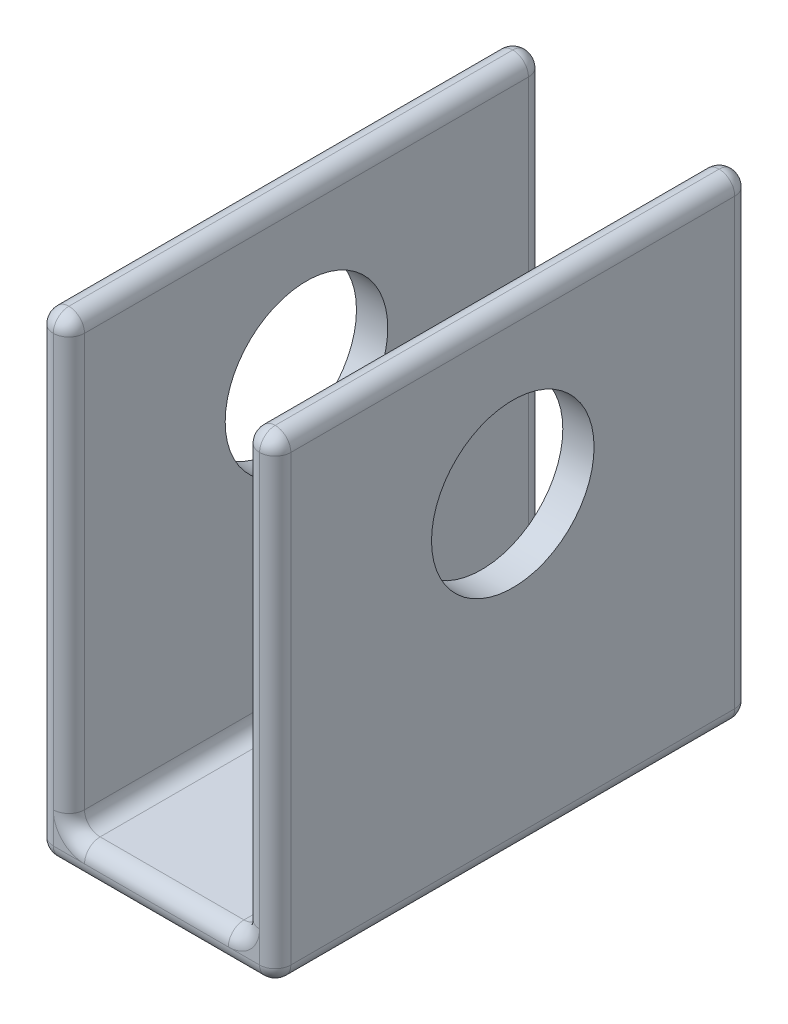
ISO-10303-21;
HEADER;
FILE_DESCRIPTION(('STEP AP214'),'2;1');
FILE_NAME('part.step','',(''),(''),'','','');
FILE_SCHEMA(('AUTOMOTIVE_DESIGN { 1 0 10303 214 1 1 1 1 }'));
ENDSEC;
DATA;
#1=APPLICATION_CONTEXT('core data for automotive mechanical design processes');
#2=APPLICATION_PROTOCOL_DEFINITION('international standard','automotive_design',2000,#1);
#3=PRODUCT_CONTEXT('',#1,'mechanical');
#4=PRODUCT('Part','Part','',(#3));
#5=PRODUCT_RELATED_PRODUCT_CATEGORY('part','',(#4));
#6=PRODUCT_DEFINITION_FORMATION('','',#4);
#7=PRODUCT_DEFINITION_CONTEXT('part definition',#1,'design');
#8=PRODUCT_DEFINITION('design','',#6,#7);
#9=PRODUCT_DEFINITION_SHAPE('','',#8);
#10=(LENGTH_UNIT() NAMED_UNIT(*) SI_UNIT(.MILLI.,.METRE.));
#11=(NAMED_UNIT(*) PLANE_ANGLE_UNIT() SI_UNIT($,.RADIAN.));
#12=(NAMED_UNIT(*) SI_UNIT($,.STERADIAN.) SOLID_ANGLE_UNIT());
#13=UNCERTAINTY_MEASURE_WITH_UNIT(LENGTH_MEASURE(1.E-05),#10,'distance_accuracy_value','');
#14=(GEOMETRIC_REPRESENTATION_CONTEXT(3) GLOBAL_UNCERTAINTY_ASSIGNED_CONTEXT((#13)) GLOBAL_UNIT_ASSIGNED_CONTEXT((#10,
#11,#12)) REPRESENTATION_CONTEXT('',''));
#15=CARTESIAN_POINT('',(0.,0.,0.));
#16=DIRECTION('',(0.,0.,1.));
#17=DIRECTION('',(1.,0.,0.));
#18=AXIS2_PLACEMENT_3D('',#15,#16,#17);
#19=CARTESIAN_POINT('',(-8.25,36.75,38.));
#20=DIRECTION('',(0.,0.,-1.));
#21=DIRECTION('',(-1.,0.,0.));
#22=AXIS2_PLACEMENT_3D('',#19,#20,#21);
#23=PLANE('',#22);
#24=CARTESIAN_POINT('',(5.75,3.75,38.));
#25=DIRECTION('',(0.,0.,-1.));
#26=DIRECTION('',(-1.,0.,0.));
#27=AXIS2_PLACEMENT_3D('',#24,#25,#26);
#28=CIRCLE('',#27,2.5);
#29=CARTESIAN_POINT('',(5.75,1.25,38.));
#30=VERTEX_POINT('',#29);
#31=CARTESIAN_POINT('',(8.25,3.75,38.));
#32=VERTEX_POINT('',#31);
#33=EDGE_CURVE('E210',#30,#32,#28,.F.);
#34=ORIENTED_EDGE('',*,*,#33,.F.);
#35=DIRECTION('',(1.,0.,0.));
#36=VECTOR('',#35,1.);
#37=CARTESIAN_POINT('',(-8.25,1.25,38.));
#38=LINE('',#37,#36);
#39=CARTESIAN_POINT('',(8.25,1.25,38.));
#40=VERTEX_POINT('',#39);
#41=EDGE_CURVE('E11',#30,#40,#38,.T.);
#42=ORIENTED_EDGE('',*,*,#41,.T.);
#43=DIRECTION('',(0.,1.,0.));
#44=VECTOR('',#43,1.);
#45=CARTESIAN_POINT('',(8.25,36.75,38.));
#46=LINE('',#45,#44);
#47=EDGE_CURVE('E56',#40,#32,#46,.T.);
#48=ORIENTED_EDGE('',*,*,#47,.T.);
#49=EDGE_LOOP('',(#34,#42,#48));
#50=FACE_BOUND('',#49,.T.);
#51=ADVANCED_FACE('F45',(#50),#23,.F.);
#52=CARTESIAN_POINT('',(-8.25,36.75,0.));
#53=DIRECTION('',(0.,0.,-1.));
#54=DIRECTION('',(-1.,0.,0.));
#55=AXIS2_PLACEMENT_3D('',#52,#53,#54);
#56=PLANE('',#55);
#57=CARTESIAN_POINT('',(-5.75,3.75,0.));
#58=DIRECTION('',(0.,0.,-1.));
#59=DIRECTION('',(-1.,0.,0.));
#60=AXIS2_PLACEMENT_3D('',#57,#58,#59);
#61=CIRCLE('',#60,2.5);
#62=CARTESIAN_POINT('',(-5.75,1.25,0.));
#63=VERTEX_POINT('',#62);
#64=CARTESIAN_POINT('',(-8.25,3.75,0.));
#65=VERTEX_POINT('',#64);
#66=EDGE_CURVE('E520',#63,#65,#61,.T.);
#67=ORIENTED_EDGE('',*,*,#66,.F.);
#68=DIRECTION('',(1.,0.,0.));
#69=VECTOR('',#68,1.);
#70=CARTESIAN_POINT('',(-9.5,1.25,0.));
#71=LINE('',#70,#69);
#72=CARTESIAN_POINT('',(-8.25,1.25,0.));
#73=VERTEX_POINT('',#72);
#74=EDGE_CURVE('E514',#63,#73,#71,.F.);
#75=ORIENTED_EDGE('',*,*,#74,.T.);
#76=DIRECTION('',(0.,-1.,0.));
#77=VECTOR('',#76,1.);
#78=CARTESIAN_POINT('',(-8.25,38.,0.));
#79=LINE('',#78,#77);
#80=EDGE_CURVE('E517',#73,#65,#79,.F.);
#81=ORIENTED_EDGE('',*,*,#80,.T.);
#82=EDGE_LOOP('',(#67,#75,#81));
#83=FACE_BOUND('',#82,.T.);
#84=ADVANCED_FACE('F255',(#83),#56,.T.);
#85=CARTESIAN_POINT('',(8.25,36.75,38.));
#86=DIRECTION('',(0.,0.,-1.));
#87=DIRECTION('',(-1.,0.,0.));
#88=AXIS2_PLACEMENT_3D('',#85,#86,#87);
#89=CYLINDRICAL_SURFACE('',#88,1.25);
#90=DIRECTION('',(0.,0.,-1.));
#91=VECTOR('',#90,1.);
#92=CARTESIAN_POINT('',(8.25000000000001,38.,38.));
#93=LINE('',#92,#91);
#94=CARTESIAN_POINT('',(8.25000000000001,38.,36.75));
#95=VERTEX_POINT('',#94);
#96=CARTESIAN_POINT('',(8.25000000000001,38.,1.25));
#97=VERTEX_POINT('',#96);
#98=EDGE_CURVE('E431',#95,#97,#93,.T.);
#99=ORIENTED_EDGE('',*,*,#98,.T.);
#100=CARTESIAN_POINT('',(8.25,36.75,1.25));
#101=DIRECTION('',(0.,0.,-1.));
#102=DIRECTION('',(-1.,0.,0.));
#103=AXIS2_PLACEMENT_3D('',#100,#101,#102);
#104=CIRCLE('',#103,1.25);
#105=CARTESIAN_POINT('',(7.,36.75,1.25));
#106=VERTEX_POINT('',#105);
#107=EDGE_CURVE('E443',#97,#106,#104,.F.);
#108=ORIENTED_EDGE('',*,*,#107,.T.);
#109=DIRECTION('',(0.,0.,-1.));
#110=VECTOR('',#109,1.);
#111=CARTESIAN_POINT('',(7.,36.75,38.));
#112=LINE('',#111,#110);
#113=CARTESIAN_POINT('',(7.,36.75,36.75));
#114=VERTEX_POINT('',#113);
#115=EDGE_CURVE('E427',#114,#106,#112,.T.);
#116=ORIENTED_EDGE('',*,*,#115,.F.);
#117=CARTESIAN_POINT('',(8.25,36.75,36.75));
#118=DIRECTION('',(0.,0.,-1.));
#119=DIRECTION('',(-1.,0.,0.));
#120=AXIS2_PLACEMENT_3D('',#117,#118,#119);
#121=CIRCLE('',#120,1.25);
#122=EDGE_CURVE('E440',#114,#95,#121,.T.);
#123=ORIENTED_EDGE('',*,*,#122,.T.);
#124=EDGE_LOOP('',(#99,#108,#116,#123));
#125=FACE_BOUND('',#124,.T.);
#126=ADVANCED_FACE('F262',(#125),#89,.T.);
#127=CARTESIAN_POINT('',(7.,2.5,38.));
#128=DIRECTION('',(1.,0.,0.));
#129=DIRECTION('',(0.,1.,0.));
#130=AXIS2_PLACEMENT_3D('',#127,#128,#129);
#131=PLANE('',#130);
#132=CARTESIAN_POINT('',(7.,25.,19.));
#133=DIRECTION('',(1.,0.,0.));
#134=DIRECTION('',(0.,1.,0.));
#135=AXIS2_PLACEMENT_3D('',#132,#133,#134);
#136=CIRCLE('',#135,6.5);
#137=CARTESIAN_POINT('',(7.,31.5,19.));
#138=VERTEX_POINT('',#137);
#139=EDGE_CURVE('E417',#138,#138,#136,.T.);
#140=ORIENTED_EDGE('',*,*,#139,.T.);
#141=EDGE_LOOP('',(#140));
#142=FACE_BOUND('',#141,.T.);
#143=ORIENTED_EDGE('',*,*,#115,.T.);
#144=DIRECTION('',(0.,-1.,0.));
#145=VECTOR('',#144,1.);
#146=CARTESIAN_POINT('',(7.,2.5,1.25));
#147=LINE('',#146,#145);
#148=CARTESIAN_POINT('',(7.,3.75,1.25));
#149=VERTEX_POINT('',#148);
#150=EDGE_CURVE('E491',#106,#149,#147,.T.);
#151=ORIENTED_EDGE('',*,*,#150,.T.);
#152=DIRECTION('',(0.,0.,-1.));
#153=VECTOR('',#152,1.);
#154=CARTESIAN_POINT('',(7.,3.75,38.));
#155=LINE('',#154,#153);
#156=CARTESIAN_POINT('',(7.,3.75,36.75));
#157=VERTEX_POINT('',#156);
#158=EDGE_CURVE('E488',#149,#157,#155,.F.);
#159=ORIENTED_EDGE('',*,*,#158,.T.);
#160=DIRECTION('',(0.,-1.,0.));
#161=VECTOR('',#160,1.);
#162=CARTESIAN_POINT('',(7.,2.5,36.75));
#163=LINE('',#162,#161);
#164=EDGE_CURVE('E485',#157,#114,#163,.F.);
#165=ORIENTED_EDGE('',*,*,#164,.T.);
#166=EDGE_LOOP('',(#143,#151,#159,#165));
#167=FACE_BOUND('',#166,.T.);
#168=ADVANCED_FACE('F721',(#142,#167),#131,.F.);
#169=CARTESIAN_POINT('',(-7.,2.5,38.));
#170=DIRECTION('',(0.,-1.,0.));
#171=DIRECTION('',(0.,0.,-1.));
#172=AXIS2_PLACEMENT_3D('',#169,#170,#171);
#173=PLANE('',#172);
#174=DIRECTION('',(0.,0.,-1.));
#175=VECTOR('',#174,1.);
#176=CARTESIAN_POINT('',(5.75,2.5,0.));
#177=LINE('',#176,#175);
#178=CARTESIAN_POINT('',(5.75,2.5,36.75));
#179=VERTEX_POINT('',#178);
#180=CARTESIAN_POINT('',(5.75,2.5,1.25));
#181=VERTEX_POINT('',#180);
#182=EDGE_CURVE('E478',#179,#181,#177,.T.);
#183=ORIENTED_EDGE('',*,*,#182,.T.);
#184=DIRECTION('',(-1.,0.,0.));
#185=VECTOR('',#184,1.);
#186=CARTESIAN_POINT('',(-7.,2.5,1.25));
#187=LINE('',#186,#185);
#188=CARTESIAN_POINT('',(-5.75,2.5,1.25));
#189=VERTEX_POINT('',#188);
#190=EDGE_CURVE('E482',#181,#189,#187,.T.);
#191=ORIENTED_EDGE('',*,*,#190,.T.);
#192=DIRECTION('',(0.,0.,-1.));
#193=VECTOR('',#192,1.);
#194=CARTESIAN_POINT('',(-5.75,2.5,38.));
#195=LINE('',#194,#193);
#196=CARTESIAN_POINT('',(-5.75,2.5,36.75));
#197=VERTEX_POINT('',#196);
#198=EDGE_CURVE('E475',#189,#197,#195,.F.);
#199=ORIENTED_EDGE('',*,*,#198,.T.);
#200=DIRECTION('',(-1.,0.,0.));
#201=VECTOR('',#200,1.);
#202=CARTESIAN_POINT('',(-7.,2.5,36.75));
#203=LINE('',#202,#201);
#204=EDGE_CURVE('E472',#197,#179,#203,.F.);
#205=ORIENTED_EDGE('',*,*,#204,.T.);
#206=EDGE_LOOP('',(#183,#191,#199,#205));
#207=FACE_BOUND('',#206,.T.);
#208=ADVANCED_FACE('F723',(#207),#173,.F.);
#209=CARTESIAN_POINT('',(-7.,2.5,38.));
#210=DIRECTION('',(-1.,0.,0.));
#211=DIRECTION('',(0.,0.,1.));
#212=AXIS2_PLACEMENT_3D('',#209,#210,#211);
#213=PLANE('',#212);
#214=CARTESIAN_POINT('',(-7.,25.,19.));
#215=DIRECTION('',(-1.,0.,0.));
#216=DIRECTION('',(0.,0.,1.));
#217=AXIS2_PLACEMENT_3D('',#214,#215,#216);
#218=CIRCLE('',#217,6.5);
#219=CARTESIAN_POINT('',(-7.,25.,25.5));
#220=VERTEX_POINT('',#219);
#221=EDGE_CURVE('E411',#220,#220,#218,.T.);
#222=ORIENTED_EDGE('',*,*,#221,.T.);
#223=EDGE_LOOP('',(#222));
#224=FACE_BOUND('',#223,.T.);
#225=DIRECTION('',(0.,0.,-1.));
#226=VECTOR('',#225,1.);
#227=CARTESIAN_POINT('',(-7.,3.75,0.));
#228=LINE('',#227,#226);
#229=CARTESIAN_POINT('',(-7.,3.75,36.75));
#230=VERTEX_POINT('',#229);
#231=CARTESIAN_POINT('',(-7.,3.75,1.25));
#232=VERTEX_POINT('',#231);
#233=EDGE_CURVE('E497',#230,#232,#228,.T.);
#234=ORIENTED_EDGE('',*,*,#233,.T.);
#235=DIRECTION('',(0.,1.,0.));
#236=VECTOR('',#235,1.);
#237=CARTESIAN_POINT('',(-7.,36.75,1.25));
#238=LINE('',#237,#236);
#239=CARTESIAN_POINT('',(-7.,36.75,1.25));
#240=VERTEX_POINT('',#239);
#241=EDGE_CURVE('E500',#232,#240,#238,.T.);
#242=ORIENTED_EDGE('',*,*,#241,.T.);
#243=DIRECTION('',(0.,0.,-1.));
#244=VECTOR('',#243,1.);
#245=CARTESIAN_POINT('',(-7.,36.75,38.));
#246=LINE('',#245,#244);
#247=CARTESIAN_POINT('',(-7.,36.75,36.75));
#248=VERTEX_POINT('',#247);
#249=EDGE_CURVE('E423',#248,#240,#246,.T.);
#250=ORIENTED_EDGE('',*,*,#249,.F.);
#251=DIRECTION('',(0.,1.,0.));
#252=VECTOR('',#251,1.);
#253=CARTESIAN_POINT('',(-7.,2.5,36.75));
#254=LINE('',#253,#252);
#255=EDGE_CURVE('E494',#248,#230,#254,.F.);
#256=ORIENTED_EDGE('',*,*,#255,.T.);
#257=EDGE_LOOP('',(#234,#242,#250,#256));
#258=FACE_BOUND('',#257,.T.);
#259=ADVANCED_FACE('F635',(#224,#258),#213,.F.);
#260=CARTESIAN_POINT('',(-8.25,36.75,38.));
#261=DIRECTION('',(0.,0.,-1.));
#262=DIRECTION('',(-1.,0.,0.));
#263=AXIS2_PLACEMENT_3D('',#260,#261,#262);
#264=CYLINDRICAL_SURFACE('',#263,1.25);
#265=ORIENTED_EDGE('',*,*,#249,.T.);
#266=CARTESIAN_POINT('',(-8.25,36.75,1.25));
#267=DIRECTION('',(0.,0.,-1.));
#268=DIRECTION('',(-1.,0.,0.));
#269=AXIS2_PLACEMENT_3D('',#266,#267,#268);
#270=CIRCLE('',#269,1.25);
#271=CARTESIAN_POINT('',(-8.25000000000001,38.,1.25));
#272=VERTEX_POINT('',#271);
#273=EDGE_CURVE('E437',#240,#272,#270,.F.);
#274=ORIENTED_EDGE('',*,*,#273,.T.);
#275=DIRECTION('',(0.,0.,-1.));
#276=VECTOR('',#275,1.);
#277=CARTESIAN_POINT('',(-8.25000000000001,38.,38.));
#278=LINE('',#277,#276);
#279=CARTESIAN_POINT('',(-8.25000000000001,38.,36.75));
#280=VERTEX_POINT('',#279);
#281=EDGE_CURVE('E99',#280,#272,#278,.T.);
#282=ORIENTED_EDGE('',*,*,#281,.F.);
#283=CARTESIAN_POINT('',(-8.25,36.75,36.75));
#284=DIRECTION('',(0.,0.,-1.));
#285=DIRECTION('',(-1.,0.,0.));
#286=AXIS2_PLACEMENT_3D('',#283,#284,#285);
#287=CIRCLE('',#286,1.25);
#288=EDGE_CURVE('E434',#280,#248,#287,.T.);
#289=ORIENTED_EDGE('',*,*,#288,.T.);
#290=EDGE_LOOP('',(#265,#274,#282,#289));
#291=FACE_BOUND('',#290,.T.);
#292=ADVANCED_FACE('F639',(#291),#264,.T.);
#293=CARTESIAN_POINT('',(-9.5,0.,38.));
#294=DIRECTION('',(1.,0.,0.));
#295=DIRECTION('',(0.,0.,-1.));
#296=AXIS2_PLACEMENT_3D('',#293,#294,#295);
#297=PLANE('',#296);
#298=DIRECTION('',(0.,-1.,0.));
#299=VECTOR('',#298,1.);
#300=CARTESIAN_POINT('',(-9.5,0.,1.25));
#301=LINE('',#300,#299);
#302=CARTESIAN_POINT('',(-9.5,36.75,1.25));
#303=VERTEX_POINT('',#302);
#304=CARTESIAN_POINT('',(-9.5,1.25,1.25));
#305=VERTEX_POINT('',#304);
#306=EDGE_CURVE('E465',#303,#305,#301,.T.);
#307=ORIENTED_EDGE('',*,*,#306,.T.);
#308=DIRECTION('',(0.,0.,-1.));
#309=VECTOR('',#308,1.);
#310=CARTESIAN_POINT('',(-9.5,1.25,38.));
#311=LINE('',#310,#309);
#312=CARTESIAN_POINT('',(-9.5,1.25,36.75));
#313=VERTEX_POINT('',#312);
#314=EDGE_CURVE('E468',#305,#313,#311,.F.);
#315=ORIENTED_EDGE('',*,*,#314,.T.);
#316=DIRECTION('',(0.,-1.,0.));
#317=VECTOR('',#316,1.);
#318=CARTESIAN_POINT('',(-9.5,0.,36.75));
#319=LINE('',#318,#317);
#320=CARTESIAN_POINT('',(-9.5,36.75,36.75));
#321=VERTEX_POINT('',#320);
#322=EDGE_CURVE('E307',#313,#321,#319,.F.);
#323=ORIENTED_EDGE('',*,*,#322,.T.);
#324=DIRECTION('',(0.,0.,-1.));
#325=VECTOR('',#324,1.);
#326=CARTESIAN_POINT('',(-9.5,36.75,38.));
#327=LINE('',#326,#325);
#328=EDGE_CURVE('E460',#321,#303,#327,.T.);
#329=ORIENTED_EDGE('',*,*,#328,.T.);
#330=EDGE_LOOP('',(#307,#315,#323,#329));
#331=FACE_BOUND('',#330,.T.);
#332=CARTESIAN_POINT('',(-9.5,25.,19.));
#333=DIRECTION('',(1.,0.,0.));
#334=DIRECTION('',(0.,0.,-1.));
#335=AXIS2_PLACEMENT_3D('',#332,#333,#334);
#336=CIRCLE('',#335,6.5);
#337=CARTESIAN_POINT('',(-9.5,25.,12.5));
#338=VERTEX_POINT('',#337);
#339=EDGE_CURVE('E405',#338,#338,#336,.T.);
#340=ORIENTED_EDGE('',*,*,#339,.T.);
#341=EDGE_LOOP('',(#340));
#342=FACE_BOUND('',#341,.T.);
#343=ADVANCED_FACE('F651',(#331,#342),#297,.F.);
#344=CARTESIAN_POINT('',(-9.5,0.,38.));
#345=DIRECTION('',(0.,1.,0.));
#346=DIRECTION('',(0.,0.,1.));
#347=AXIS2_PLACEMENT_3D('',#344,#345,#346);
#348=PLANE('',#347);
#349=DIRECTION('',(1.,0.,0.));
#350=VECTOR('',#349,1.);
#351=CARTESIAN_POINT('',(-9.5,0.,36.75));
#352=LINE('',#351,#350);
#353=CARTESIAN_POINT('',(8.25,0.,36.75));
#354=VERTEX_POINT('',#353);
#355=CARTESIAN_POINT('',(-8.25,0.,36.75));
#356=VERTEX_POINT('',#355);
#357=EDGE_CURVE('E447',#354,#356,#352,.F.);
#358=ORIENTED_EDGE('',*,*,#357,.T.);
#359=DIRECTION('',(0.,0.,-1.));
#360=VECTOR('',#359,1.);
#361=CARTESIAN_POINT('',(-8.25,0.,38.));
#362=LINE('',#361,#360);
#363=CARTESIAN_POINT('',(-8.25,0.,1.25));
#364=VERTEX_POINT('',#363);
#365=EDGE_CURVE('E456',#356,#364,#362,.T.);
#366=ORIENTED_EDGE('',*,*,#365,.T.);
#367=DIRECTION('',(1.,0.,0.));
#368=VECTOR('',#367,1.);
#369=CARTESIAN_POINT('',(9.5,0.,1.25));
#370=LINE('',#369,#368);
#371=CARTESIAN_POINT('',(8.25,0.,1.25));
#372=VERTEX_POINT('',#371);
#373=EDGE_CURVE('E453',#364,#372,#370,.T.);
#374=ORIENTED_EDGE('',*,*,#373,.T.);
#375=DIRECTION('',(0.,0.,-1.));
#376=VECTOR('',#375,1.);
#377=CARTESIAN_POINT('',(8.25,0.,38.));
#378=LINE('',#377,#376);
#379=EDGE_CURVE('E450',#372,#354,#378,.F.);
#380=ORIENTED_EDGE('',*,*,#379,.T.);
#381=EDGE_LOOP('',(#358,#366,#374,#380));
#382=FACE_BOUND('',#381,.T.);
#383=ADVANCED_FACE('F276',(#382),#348,.F.);
#384=CARTESIAN_POINT('',(9.5,0.,38.));
#385=DIRECTION('',(-1.,0.,0.));
#386=DIRECTION('',(0.,0.,1.));
#387=AXIS2_PLACEMENT_3D('',#384,#385,#386);
#388=PLANE('',#387);
#389=DIRECTION('',(0.,0.,-1.));
#390=VECTOR('',#389,1.);
#391=CARTESIAN_POINT('',(9.5,1.25,38.));
#392=LINE('',#391,#390);
#393=CARTESIAN_POINT('',(9.5,1.25,36.75));
#394=VERTEX_POINT('',#393);
#395=CARTESIAN_POINT('',(9.5,1.25,1.25));
#396=VERTEX_POINT('',#395);
#397=EDGE_CURVE('E530',#394,#396,#392,.T.);
#398=ORIENTED_EDGE('',*,*,#397,.T.);
#399=DIRECTION('',(0.,1.,0.));
#400=VECTOR('',#399,1.);
#401=CARTESIAN_POINT('',(9.5,38.,1.25));
#402=LINE('',#401,#400);
#403=CARTESIAN_POINT('',(9.5,36.75,1.25));
#404=VERTEX_POINT('',#403);
#405=EDGE_CURVE('E533',#396,#404,#402,.T.);
#406=ORIENTED_EDGE('',*,*,#405,.T.);
#407=DIRECTION('',(0.,0.,-1.));
#408=VECTOR('',#407,1.);
#409=CARTESIAN_POINT('',(9.5,36.75,38.));
#410=LINE('',#409,#408);
#411=CARTESIAN_POINT('',(9.5,36.75,36.75));
#412=VERTEX_POINT('',#411);
#413=EDGE_CURVE('E527',#404,#412,#410,.F.);
#414=ORIENTED_EDGE('',*,*,#413,.T.);
#415=DIRECTION('',(0.,1.,0.));
#416=VECTOR('',#415,1.);
#417=CARTESIAN_POINT('',(9.5,0.,36.75));
#418=LINE('',#417,#416);
#419=EDGE_CURVE('E524',#412,#394,#418,.F.);
#420=ORIENTED_EDGE('',*,*,#419,.T.);
#421=EDGE_LOOP('',(#398,#406,#414,#420));
#422=FACE_BOUND('',#421,.T.);
#423=CARTESIAN_POINT('',(9.5,25.,19.));
#424=DIRECTION('',(1.,0.,0.));
#425=DIRECTION('',(0.,0.,-1.));
#426=AXIS2_PLACEMENT_3D('',#423,#424,#425);
#427=CIRCLE('',#426,6.5);
#428=CARTESIAN_POINT('',(9.5,25.,12.5));
#429=VERTEX_POINT('',#428);
#430=EDGE_CURVE('E400',#429,#429,#427,.T.);
#431=ORIENTED_EDGE('',*,*,#430,.F.);
#432=EDGE_LOOP('',(#431));
#433=FACE_BOUND('',#432,.T.);
#434=ADVANCED_FACE('F268',(#422,#433),#388,.F.);
#435=DIRECTION('',(0.,-1.,0.));
#436=VECTOR('',#435,1.);
#437=CARTESIAN_POINT('',(-8.25,36.75,38.));
#438=LINE('',#437,#436);
#439=CARTESIAN_POINT('',(-8.25,3.75,38.));
#440=VERTEX_POINT('',#439);
#441=CARTESIAN_POINT('',(-8.25,1.25,38.));
#442=VERTEX_POINT('',#441);
#443=EDGE_CURVE('E280',#440,#442,#438,.T.);
#444=ORIENTED_EDGE('',*,*,#443,.T.);
#445=DIRECTION('',(1.,0.,0.));
#446=VECTOR('',#445,1.);
#447=CARTESIAN_POINT('',(-8.25,1.25,38.));
#448=LINE('',#447,#446);
#449=CARTESIAN_POINT('',(-5.75,1.25,38.));
#450=VERTEX_POINT('',#449);
#451=EDGE_CURVE('E217',#442,#450,#448,.T.);
#452=ORIENTED_EDGE('',*,*,#451,.T.);
#453=CARTESIAN_POINT('',(-5.75,3.75,38.));
#454=DIRECTION('',(0.,0.,-1.));
#455=DIRECTION('',(-1.,0.,0.));
#456=AXIS2_PLACEMENT_3D('',#453,#454,#455);
#457=CIRCLE('',#456,2.5);
#458=EDGE_CURVE('E281',#440,#450,#457,.F.);
#459=ORIENTED_EDGE('',*,*,#458,.F.);
#460=EDGE_LOOP('',(#444,#452,#459));
#461=FACE_BOUND('',#460,.T.);
#462=ADVANCED_FACE('F257',(#461),#23,.F.);
#463=DIRECTION('',(0.,1.,0.));
#464=VECTOR('',#463,1.);
#465=CARTESIAN_POINT('',(8.25,0.,0.));
#466=LINE('',#465,#464);
#467=CARTESIAN_POINT('',(8.25,3.75,0.));
#468=VERTEX_POINT('',#467);
#469=CARTESIAN_POINT('',(8.25,1.25,0.));
#470=VERTEX_POINT('',#469);
#471=EDGE_CURVE('E503',#468,#470,#466,.F.);
#472=ORIENTED_EDGE('',*,*,#471,.T.);
#473=DIRECTION('',(1.,0.,0.));
#474=VECTOR('',#473,1.);
#475=CARTESIAN_POINT('',(-9.5,1.25,0.));
#476=LINE('',#475,#474);
#477=CARTESIAN_POINT('',(5.75,1.25,0.));
#478=VERTEX_POINT('',#477);
#479=EDGE_CURVE('E510',#470,#478,#476,.F.);
#480=ORIENTED_EDGE('',*,*,#479,.T.);
#481=CARTESIAN_POINT('',(5.75,3.75,0.));
#482=DIRECTION('',(0.,0.,-1.));
#483=DIRECTION('',(-1.,0.,0.));
#484=AXIS2_PLACEMENT_3D('',#481,#482,#483);
#485=CIRCLE('',#484,2.5);
#486=EDGE_CURVE('E506',#468,#478,#485,.T.);
#487=ORIENTED_EDGE('',*,*,#486,.F.);
#488=EDGE_LOOP('',(#472,#480,#487));
#489=FACE_BOUND('',#488,.T.);
#490=ADVANCED_FACE('F265',(#489),#56,.T.);
#491=CARTESIAN_POINT('',(-9.5,25.,19.));
#492=DIRECTION('',(1.,0.,0.));
#493=DIRECTION('',(0.,0.,-1.));
#494=AXIS2_PLACEMENT_3D('',#491,#492,#493);
#495=CYLINDRICAL_SURFACE('',#494,6.5);
#496=ORIENTED_EDGE('',*,*,#430,.T.);
#497=EDGE_LOOP('',(#496));
#498=FACE_BOUND('',#497,.T.);
#499=ORIENTED_EDGE('',*,*,#139,.F.);
#500=EDGE_LOOP('',(#499));
#501=FACE_BOUND('',#500,.T.);
#502=ADVANCED_FACE('F274',(#498,#501),#495,.F.);
#503=ORIENTED_EDGE('',*,*,#339,.F.);
#504=EDGE_LOOP('',(#503));
#505=FACE_BOUND('',#504,.T.);
#506=ORIENTED_EDGE('',*,*,#221,.F.);
#507=EDGE_LOOP('',(#506));
#508=FACE_BOUND('',#507,.T.);
#509=ADVANCED_FACE('F713',(#505,#508),#495,.F.);
#510=CARTESIAN_POINT('',(8.25,36.75,36.75));
#511=DIRECTION('',(0.,0.,-1.));
#512=DIRECTION('',(-1.,0.,0.));
#513=AXIS2_PLACEMENT_3D('',#510,#511,#512);
#514=SPHERICAL_SURFACE('',#513,1.25);
#515=CARTESIAN_POINT('',(8.25000000000001,36.75,36.75));
#516=DIRECTION('',(-1.,0.,0.));
#517=DIRECTION('',(0.,0.,1.));
#518=AXIS2_PLACEMENT_3D('',#515,#516,#517);
#519=CIRCLE('',#518,1.25);
#520=CARTESIAN_POINT('',(8.25,36.75,38.));
#521=VERTEX_POINT('',#520);
#522=EDGE_CURVE('E49',#521,#95,#519,.T.);
#523=ORIENTED_EDGE('',*,*,#522,.T.);
#524=ORIENTED_EDGE('',*,*,#122,.F.);
#525=CARTESIAN_POINT('',(8.25,36.75,36.75));
#526=DIRECTION('',(0.,-1.,0.));
#527=DIRECTION('',(1.,0.,0.));
#528=AXIS2_PLACEMENT_3D('',#525,#526,#527);
#529=CIRCLE('',#528,1.25);
#530=EDGE_CURVE('E393',#521,#114,#529,.T.);
#531=ORIENTED_EDGE('',*,*,#530,.F.);
#532=EDGE_LOOP('',(#523,#524,#531));
#533=FACE_BOUND('',#532,.T.);
#534=ADVANCED_FACE('F47',(#533),#514,.T.);
#535=CARTESIAN_POINT('',(8.25,36.75,36.75));
#536=DIRECTION('',(0.,0.,1.));
#537=DIRECTION('',(1.,0.,0.));
#538=AXIS2_PLACEMENT_3D('',#535,#536,#537);
#539=SPHERICAL_SURFACE('',#538,1.25);
#540=CARTESIAN_POINT('',(8.25,36.75,36.75));
#541=DIRECTION('',(0.,0.,1.));
#542=DIRECTION('',(1.,0.,0.));
#543=AXIS2_PLACEMENT_3D('',#540,#541,#542);
#544=CIRCLE('',#543,1.25);
#545=EDGE_CURVE('E383',#95,#412,#544,.F.);
#546=ORIENTED_EDGE('',*,*,#545,.F.);
#547=ORIENTED_EDGE('',*,*,#522,.F.);
#548=CARTESIAN_POINT('',(8.25,36.75,36.75));
#549=DIRECTION('',(0.,1.,0.));
#550=DIRECTION('',(0.,0.,1.));
#551=AXIS2_PLACEMENT_3D('',#548,#549,#550);
#552=CIRCLE('',#551,1.25);
#553=EDGE_CURVE('E387',#412,#521,#552,.F.);
#554=ORIENTED_EDGE('',*,*,#553,.F.);
#555=EDGE_LOOP('',(#546,#547,#554));
#556=FACE_BOUND('',#555,.T.);
#557=ADVANCED_FACE('F708',(#556),#539,.T.);
#558=CARTESIAN_POINT('',(8.25,36.75,36.75));
#559=DIRECTION('',(0.,-1.,0.));
#560=DIRECTION('',(1.,0.,0.));
#561=AXIS2_PLACEMENT_3D('',#558,#559,#560);
#562=CYLINDRICAL_SURFACE('',#561,1.25);
#563=CARTESIAN_POINT('',(8.25,3.75,36.75));
#564=DIRECTION('',(0.,-1.,0.));
#565=DIRECTION('',(0.,0.,-1.));
#566=AXIS2_PLACEMENT_3D('',#563,#564,#565);
#567=CIRCLE('',#566,1.25);
#568=EDGE_CURVE('E380',#32,#157,#567,.T.);
#569=ORIENTED_EDGE('',*,*,#568,.F.);
#570=DIRECTION('',(0.,-1.,0.));
#571=VECTOR('',#570,1.);
#572=CARTESIAN_POINT('',(8.25,36.75,38.));
#573=LINE('',#572,#571);
#574=EDGE_CURVE('E391',#521,#32,#573,.T.);
#575=ORIENTED_EDGE('',*,*,#574,.F.);
#576=ORIENTED_EDGE('',*,*,#530,.T.);
#577=ORIENTED_EDGE('',*,*,#164,.F.);
#578=EDGE_LOOP('',(#569,#575,#576,#577));
#579=FACE_BOUND('',#578,.T.);
#580=ADVANCED_FACE('F706',(#579),#562,.T.);
#581=CARTESIAN_POINT('',(8.25,36.75,36.75));
#582=DIRECTION('',(0.,1.,0.));
#583=DIRECTION('',(0.,0.,1.));
#584=AXIS2_PLACEMENT_3D('',#581,#582,#583);
#585=CYLINDRICAL_SURFACE('',#584,1.25);
#586=ORIENTED_EDGE('',*,*,#574,.T.);
#587=ORIENTED_EDGE('',*,*,#47,.F.);
#588=CARTESIAN_POINT('',(8.25,1.25,36.75));
#589=DIRECTION('',(0.,-1.,0.));
#590=DIRECTION('',(0.,0.,-1.));
#591=AXIS2_PLACEMENT_3D('',#588,#589,#590);
#592=CIRCLE('',#591,1.25);
#593=EDGE_CURVE('E377',#394,#40,#592,.T.);
#594=ORIENTED_EDGE('',*,*,#593,.F.);
#595=ORIENTED_EDGE('',*,*,#419,.F.);
#596=ORIENTED_EDGE('',*,*,#553,.T.);
#597=EDGE_LOOP('',(#586,#587,#594,#595,#596));
#598=FACE_BOUND('',#597,.T.);
#599=ADVANCED_FACE('F681',(#598),#585,.T.);
#600=CARTESIAN_POINT('',(8.25,36.75,38.));
#601=DIRECTION('',(0.,0.,-1.));
#602=DIRECTION('',(-1.,0.,0.));
#603=AXIS2_PLACEMENT_3D('',#600,#601,#602);
#604=CYLINDRICAL_SURFACE('',#603,1.25);
#605=CARTESIAN_POINT('',(8.25,36.75,1.25));
#606=DIRECTION('',(0.,0.,-1.));
#607=DIRECTION('',(-1.,0.,0.));
#608=AXIS2_PLACEMENT_3D('',#605,#606,#607);
#609=CIRCLE('',#608,1.25);
#610=EDGE_CURVE('E373',#97,#404,#609,.T.);
#611=ORIENTED_EDGE('',*,*,#610,.F.);
#612=ORIENTED_EDGE('',*,*,#98,.F.);
#613=ORIENTED_EDGE('',*,*,#545,.T.);
#614=ORIENTED_EDGE('',*,*,#413,.F.);
#615=EDGE_LOOP('',(#611,#612,#613,#614));
#616=FACE_BOUND('',#615,.T.);
#617=ADVANCED_FACE('F700',(#616),#604,.T.);
#618=CARTESIAN_POINT('',(8.25,36.75,1.25));
#619=DIRECTION('',(0.,0.,-1.));
#620=DIRECTION('',(-1.,0.,0.));
#621=AXIS2_PLACEMENT_3D('',#618,#619,#620);
#622=SPHERICAL_SURFACE('',#621,1.25);
#623=ORIENTED_EDGE('',*,*,#107,.F.);
#624=CARTESIAN_POINT('',(8.25,36.75,1.25));
#625=DIRECTION('',(1.,0.,0.));
#626=DIRECTION('',(0.,0.,-1.));
#627=AXIS2_PLACEMENT_3D('',#624,#625,#626);
#628=CIRCLE('',#627,1.25);
#629=CARTESIAN_POINT('',(8.25,36.75,0.));
#630=VERTEX_POINT('',#629);
#631=EDGE_CURVE('E83',#630,#97,#628,.T.);
#632=ORIENTED_EDGE('',*,*,#631,.F.);
#633=CARTESIAN_POINT('',(8.25,36.75,1.25));
#634=DIRECTION('',(0.,-1.,0.));
#635=DIRECTION('',(1.,0.,0.));
#636=AXIS2_PLACEMENT_3D('',#633,#634,#635);
#637=CIRCLE('',#636,1.25);
#638=EDGE_CURVE('E368',#106,#630,#637,.T.);
#639=ORIENTED_EDGE('',*,*,#638,.F.);
#640=EDGE_LOOP('',(#623,#632,#639));
#641=FACE_BOUND('',#640,.T.);
#642=ADVANCED_FACE('F694',(#641),#622,.T.);
#643=CARTESIAN_POINT('',(5.75,3.75,36.75));
#644=DIRECTION('',(0.,0.,-1.));
#645=DIRECTION('',(-1.,0.,0.));
#646=AXIS2_PLACEMENT_3D('',#643,#644,#645);
#647=TOROIDAL_SURFACE('',#646,2.5,1.25);
#648=ORIENTED_EDGE('',*,*,#33,.T.);
#649=ORIENTED_EDGE('',*,*,#568,.T.);
#650=CARTESIAN_POINT('',(5.75,3.75,36.75));
#651=DIRECTION('',(0.,0.,-1.));
#652=DIRECTION('',(-1.,0.,0.));
#653=AXIS2_PLACEMENT_3D('',#650,#651,#652);
#654=CIRCLE('',#653,1.25);
#655=EDGE_CURVE('E225',#179,#157,#654,.F.);
#656=ORIENTED_EDGE('',*,*,#655,.F.);
#657=CARTESIAN_POINT('',(5.75,1.25,36.75));
#658=DIRECTION('',(1.,0.,0.));
#659=DIRECTION('',(0.,0.,-1.));
#660=AXIS2_PLACEMENT_3D('',#657,#658,#659);
#661=CIRCLE('',#660,1.25);
#662=EDGE_CURVE('E221',#30,#179,#661,.F.);
#663=ORIENTED_EDGE('',*,*,#662,.F.);
#664=EDGE_LOOP('',(#648,#649,#656,#663));
#665=FACE_BOUND('',#664,.T.);
#666=ADVANCED_FACE('F223',(#665),#647,.T.);
#667=CARTESIAN_POINT('',(8.25,1.25,36.75));
#668=DIRECTION('',(0.,0.,1.));
#669=DIRECTION('',(1.,0.,0.));
#670=AXIS2_PLACEMENT_3D('',#667,#668,#669);
#671=SPHERICAL_SURFACE('',#670,1.25);
#672=CARTESIAN_POINT('',(8.25,1.25,36.75));
#673=DIRECTION('',(0.,0.,1.));
#674=DIRECTION('',(1.,0.,0.));
#675=AXIS2_PLACEMENT_3D('',#672,#673,#674);
#676=CIRCLE('',#675,1.25);
#677=EDGE_CURVE('E360',#394,#354,#676,.F.);
#678=ORIENTED_EDGE('',*,*,#677,.F.);
#679=ORIENTED_EDGE('',*,*,#593,.T.);
#680=CARTESIAN_POINT('',(8.25,1.25,36.75));
#681=DIRECTION('',(1.,0.,0.));
#682=DIRECTION('',(0.,1.,0.));
#683=AXIS2_PLACEMENT_3D('',#680,#681,#682);
#684=CIRCLE('',#683,1.25);
#685=EDGE_CURVE('E65',#354,#40,#684,.F.);
#686=ORIENTED_EDGE('',*,*,#685,.F.);
#687=EDGE_LOOP('',(#678,#679,#686));
#688=FACE_BOUND('',#687,.T.);
#689=ADVANCED_FACE('F683',(#688),#671,.T.);
#690=CARTESIAN_POINT('',(8.25,36.75,1.25));
#691=DIRECTION('',(0.,1.,0.));
#692=DIRECTION('',(0.,0.,1.));
#693=AXIS2_PLACEMENT_3D('',#690,#691,#692);
#694=SPHERICAL_SURFACE('',#693,1.25);
#695=ORIENTED_EDGE('',*,*,#631,.T.);
#696=ORIENTED_EDGE('',*,*,#610,.T.);
#697=CARTESIAN_POINT('',(8.25,36.75,1.25));
#698=DIRECTION('',(0.,1.,0.));
#699=DIRECTION('',(0.,0.,1.));
#700=AXIS2_PLACEMENT_3D('',#697,#698,#699);
#701=CIRCLE('',#700,1.25);
#702=EDGE_CURVE('E357',#630,#404,#701,.F.);
#703=ORIENTED_EDGE('',*,*,#702,.F.);
#704=EDGE_LOOP('',(#695,#696,#703));
#705=FACE_BOUND('',#704,.T.);
#706=ADVANCED_FACE('F685',(#705),#694,.T.);
#707=CARTESIAN_POINT('',(8.25,2.5,1.25));
#708=DIRECTION('',(0.,1.,0.));
#709=DIRECTION('',(-1.,0.,0.));
#710=AXIS2_PLACEMENT_3D('',#707,#708,#709);
#711=CYLINDRICAL_SURFACE('',#710,1.25);
#712=ORIENTED_EDGE('',*,*,#150,.F.);
#713=ORIENTED_EDGE('',*,*,#638,.T.);
#714=DIRECTION('',(0.,-1.,0.));
#715=VECTOR('',#714,1.);
#716=CARTESIAN_POINT('',(8.25,36.75,0.));
#717=LINE('',#716,#715);
#718=EDGE_CURVE('E353',#468,#630,#717,.F.);
#719=ORIENTED_EDGE('',*,*,#718,.F.);
#720=CARTESIAN_POINT('',(8.25,3.75,1.25));
#721=DIRECTION('',(0.,-1.,0.));
#722=DIRECTION('',(0.,0.,-1.));
#723=AXIS2_PLACEMENT_3D('',#720,#721,#722);
#724=CIRCLE('',#723,1.25);
#725=EDGE_CURVE('E349',#149,#468,#724,.T.);
#726=ORIENTED_EDGE('',*,*,#725,.F.);
#727=EDGE_LOOP('',(#712,#713,#719,#726));
#728=FACE_BOUND('',#727,.T.);
#729=ADVANCED_FACE('F691',(#728),#711,.T.);
#730=CARTESIAN_POINT('',(5.75,3.75,38.));
#731=DIRECTION('',(0.,0.,1.));
#732=DIRECTION('',(1.,0.,0.));
#733=AXIS2_PLACEMENT_3D('',#730,#731,#732);
#734=CYLINDRICAL_SURFACE('',#733,1.25);
#735=ORIENTED_EDGE('',*,*,#655,.T.);
#736=ORIENTED_EDGE('',*,*,#158,.F.);
#737=CARTESIAN_POINT('',(5.75,3.75,1.25));
#738=DIRECTION('',(0.,0.,-1.));
#739=DIRECTION('',(-1.,0.,0.));
#740=AXIS2_PLACEMENT_3D('',#737,#738,#739);
#741=CIRCLE('',#740,1.25);
#742=EDGE_CURVE('E345',#181,#149,#741,.F.);
#743=ORIENTED_EDGE('',*,*,#742,.F.);
#744=ORIENTED_EDGE('',*,*,#182,.F.);
#745=EDGE_LOOP('',(#735,#736,#743,#744));
#746=FACE_BOUND('',#745,.T.);
#747=ADVANCED_FACE('F252',(#746),#734,.F.);
#748=CARTESIAN_POINT('',(-8.25,1.25,36.75));
#749=DIRECTION('',(-1.,0.,0.));
#750=DIRECTION('',(0.,0.,1.));
#751=AXIS2_PLACEMENT_3D('',#748,#749,#750);
#752=CYLINDRICAL_SURFACE('',#751,1.25);
#753=CARTESIAN_POINT('',(-5.75,1.25,36.75));
#754=DIRECTION('',(-1.,0.,0.));
#755=DIRECTION('',(0.,0.,1.));
#756=AXIS2_PLACEMENT_3D('',#753,#754,#755);
#757=CIRCLE('',#756,1.25);
#758=EDGE_CURVE('E236',#450,#197,#757,.T.);
#759=ORIENTED_EDGE('',*,*,#758,.F.);
#760=DIRECTION('',(-1.,0.,0.));
#761=VECTOR('',#760,1.);
#762=CARTESIAN_POINT('',(-8.25,1.25,38.));
#763=LINE('',#762,#761);
#764=EDGE_CURVE('E230',#30,#450,#763,.T.);
#765=ORIENTED_EDGE('',*,*,#764,.F.);
#766=ORIENTED_EDGE('',*,*,#662,.T.);
#767=ORIENTED_EDGE('',*,*,#204,.F.);
#768=EDGE_LOOP('',(#759,#765,#766,#767));
#769=FACE_BOUND('',#768,.T.);
#770=ADVANCED_FACE('F234',(#769),#752,.T.);
#771=CARTESIAN_POINT('',(-8.25,1.25,36.75));
#772=DIRECTION('',(1.,0.,0.));
#773=DIRECTION('',(0.,0.,-1.));
#774=AXIS2_PLACEMENT_3D('',#771,#772,#773);
#775=CYLINDRICAL_SURFACE('',#774,1.25);
#776=ORIENTED_EDGE('',*,*,#764,.T.);
#777=ORIENTED_EDGE('',*,*,#451,.F.);
#778=CARTESIAN_POINT('',(-8.25,1.25,36.75));
#779=DIRECTION('',(-1.,0.,0.));
#780=DIRECTION('',(0.,0.,1.));
#781=AXIS2_PLACEMENT_3D('',#778,#779,#780);
#782=CIRCLE('',#781,1.25);
#783=EDGE_CURVE('E290',#356,#442,#782,.T.);
#784=ORIENTED_EDGE('',*,*,#783,.F.);
#785=ORIENTED_EDGE('',*,*,#357,.F.);
#786=ORIENTED_EDGE('',*,*,#685,.T.);
#787=ORIENTED_EDGE('',*,*,#41,.F.);
#788=EDGE_LOOP('',(#776,#777,#784,#785,#786,#787));
#789=FACE_BOUND('',#788,.T.);
#790=ADVANCED_FACE('F241',(#789),#775,.T.);
#791=CARTESIAN_POINT('',(8.25,1.25,38.));
#792=DIRECTION('',(0.,0.,-1.));
#793=DIRECTION('',(-1.,0.,0.));
#794=AXIS2_PLACEMENT_3D('',#791,#792,#793);
#795=CYLINDRICAL_SURFACE('',#794,1.25);
#796=ORIENTED_EDGE('',*,*,#677,.T.);
#797=ORIENTED_EDGE('',*,*,#379,.F.);
#798=CARTESIAN_POINT('',(8.25,1.25,1.25));
#799=DIRECTION('',(0.,0.,-1.));
#800=DIRECTION('',(-1.,0.,0.));
#801=AXIS2_PLACEMENT_3D('',#798,#799,#800);
#802=CIRCLE('',#801,1.25);
#803=EDGE_CURVE('E303',#396,#372,#802,.T.);
#804=ORIENTED_EDGE('',*,*,#803,.F.);
#805=ORIENTED_EDGE('',*,*,#397,.F.);
#806=EDGE_LOOP('',(#796,#797,#804,#805));
#807=FACE_BOUND('',#806,.T.);
#808=ADVANCED_FACE('F243',(#807),#795,.T.);
#809=CARTESIAN_POINT('',(8.25,0.,1.25));
#810=DIRECTION('',(0.,-1.,0.));
#811=DIRECTION('',(0.,0.,-1.));
#812=AXIS2_PLACEMENT_3D('',#809,#810,#811);
#813=CYLINDRICAL_SURFACE('',#812,1.25);
#814=ORIENTED_EDGE('',*,*,#702,.T.);
#815=ORIENTED_EDGE('',*,*,#405,.F.);
#816=CARTESIAN_POINT('',(8.25,1.25,1.25));
#817=DIRECTION('',(0.,-1.,0.));
#818=DIRECTION('',(0.,0.,-1.));
#819=AXIS2_PLACEMENT_3D('',#816,#817,#818);
#820=CIRCLE('',#819,1.25);
#821=EDGE_CURVE('E330',#470,#396,#820,.T.);
#822=ORIENTED_EDGE('',*,*,#821,.F.);
#823=ORIENTED_EDGE('',*,*,#471,.F.);
#824=ORIENTED_EDGE('',*,*,#718,.T.);
#825=EDGE_LOOP('',(#814,#815,#822,#823,#824));
#826=FACE_BOUND('',#825,.T.);
#827=ADVANCED_FACE('F249',(#826),#813,.T.);
#828=CARTESIAN_POINT('',(5.75,3.75,1.25));
#829=DIRECTION('',(0.,0.,-1.));
#830=DIRECTION('',(-1.,0.,0.));
#831=AXIS2_PLACEMENT_3D('',#828,#829,#830);
#832=TOROIDAL_SURFACE('',#831,2.5,1.25);
#833=ORIENTED_EDGE('',*,*,#725,.T.);
#834=ORIENTED_EDGE('',*,*,#486,.T.);
#835=CARTESIAN_POINT('',(5.75,1.25,1.25));
#836=DIRECTION('',(1.,0.,0.));
#837=DIRECTION('',(0.,0.,-1.));
#838=AXIS2_PLACEMENT_3D('',#835,#836,#837);
#839=CIRCLE('',#838,1.25);
#840=EDGE_CURVE('E326',#181,#478,#839,.F.);
#841=ORIENTED_EDGE('',*,*,#840,.F.);
#842=ORIENTED_EDGE('',*,*,#742,.T.);
#843=EDGE_LOOP('',(#833,#834,#841,#842));
#844=FACE_BOUND('',#843,.T.);
#845=ADVANCED_FACE('F669',(#844),#832,.T.);
#846=CARTESIAN_POINT('',(-5.75,3.75,36.75));
#847=DIRECTION('',(0.,0.,-1.));
#848=DIRECTION('',(-1.,0.,0.));
#849=AXIS2_PLACEMENT_3D('',#846,#847,#848);
#850=TOROIDAL_SURFACE('',#849,2.5,1.25);
#851=CARTESIAN_POINT('',(-5.75,3.75,36.75));
#852=DIRECTION('',(0.,0.,-1.));
#853=DIRECTION('',(-1.,0.,0.));
#854=AXIS2_PLACEMENT_3D('',#851,#852,#853);
#855=CIRCLE('',#854,1.25);
#856=EDGE_CURVE('E322',#230,#197,#855,.F.);
#857=ORIENTED_EDGE('',*,*,#856,.F.);
#858=CARTESIAN_POINT('',(-8.25,3.75,36.75));
#859=DIRECTION('',(0.,-1.,0.));
#860=DIRECTION('',(0.,0.,-1.));
#861=AXIS2_PLACEMENT_3D('',#858,#859,#860);
#862=CIRCLE('',#861,1.25);
#863=EDGE_CURVE('E302',#440,#230,#862,.F.);
#864=ORIENTED_EDGE('',*,*,#863,.F.);
#865=ORIENTED_EDGE('',*,*,#458,.T.);
#866=ORIENTED_EDGE('',*,*,#758,.T.);
#867=EDGE_LOOP('',(#857,#864,#865,#866));
#868=FACE_BOUND('',#867,.T.);
#869=ADVANCED_FACE('F658',(#868),#850,.T.);
#870=CARTESIAN_POINT('',(-8.25,36.75,36.75));
#871=DIRECTION('',(0.,0.,-1.));
#872=DIRECTION('',(-1.,0.,0.));
#873=AXIS2_PLACEMENT_3D('',#870,#871,#872);
#874=SPHERICAL_SURFACE('',#873,1.25);
#875=CARTESIAN_POINT('',(-8.25,36.75,36.75));
#876=DIRECTION('',(0.,-1.,0.));
#877=DIRECTION('',(1.,0.,0.));
#878=AXIS2_PLACEMENT_3D('',#875,#876,#877);
#879=CIRCLE('',#878,1.25);
#880=CARTESIAN_POINT('',(-8.25,36.75,38.));
#881=VERTEX_POINT('',#880);
#882=EDGE_CURVE('E340',#248,#881,#879,.T.);
#883=ORIENTED_EDGE('',*,*,#882,.F.);
#884=ORIENTED_EDGE('',*,*,#288,.F.);
#885=CARTESIAN_POINT('',(-8.25,36.75,36.75));
#886=DIRECTION('',(-1.,0.,0.));
#887=DIRECTION('',(0.,-1.,0.));
#888=AXIS2_PLACEMENT_3D('',#885,#886,#887);
#889=CIRCLE('',#888,1.25);
#890=EDGE_CURVE('E313',#881,#280,#889,.T.);
#891=ORIENTED_EDGE('',*,*,#890,.F.);
#892=EDGE_LOOP('',(#883,#884,#891));
#893=FACE_BOUND('',#892,.T.);
#894=ADVANCED_FACE('F642',(#893),#874,.T.);
#895=CARTESIAN_POINT('',(-8.25,36.75,36.75));
#896=DIRECTION('',(0.,1.,0.));
#897=DIRECTION('',(0.,0.,1.));
#898=AXIS2_PLACEMENT_3D('',#895,#896,#897);
#899=CYLINDRICAL_SURFACE('',#898,1.25);
#900=ORIENTED_EDGE('',*,*,#255,.F.);
#901=ORIENTED_EDGE('',*,*,#882,.T.);
#902=DIRECTION('',(0.,1.,0.));
#903=VECTOR('',#902,1.);
#904=CARTESIAN_POINT('',(-8.25,36.75,38.));
#905=LINE('',#904,#903);
#906=EDGE_CURVE('E309',#440,#881,#905,.T.);
#907=ORIENTED_EDGE('',*,*,#906,.F.);
#908=ORIENTED_EDGE('',*,*,#863,.T.);
#909=EDGE_LOOP('',(#900,#901,#907,#908));
#910=FACE_BOUND('',#909,.T.);
#911=ADVANCED_FACE('F655',(#910),#899,.T.);
#912=CARTESIAN_POINT('',(-8.25,1.25,36.75));
#913=DIRECTION('',(0.,0.,1.));
#914=DIRECTION('',(0.,-1.,0.));
#915=AXIS2_PLACEMENT_3D('',#912,#913,#914);
#916=SPHERICAL_SURFACE('',#915,1.25);
#917=CARTESIAN_POINT('',(-8.25,1.25,36.75));
#918=DIRECTION('',(0.,0.,1.));
#919=DIRECTION('',(1.,0.,0.));
#920=AXIS2_PLACEMENT_3D('',#917,#918,#919);
#921=CIRCLE('',#920,1.25);
#922=EDGE_CURVE('E299',#356,#313,#921,.F.);
#923=ORIENTED_EDGE('',*,*,#922,.F.);
#924=ORIENTED_EDGE('',*,*,#783,.T.);
#925=CARTESIAN_POINT('',(-8.25,1.25,36.75));
#926=DIRECTION('',(0.,-1.,0.));
#927=DIRECTION('',(1.,0.,0.));
#928=AXIS2_PLACEMENT_3D('',#925,#926,#927);
#929=CIRCLE('',#928,1.25);
#930=EDGE_CURVE('E297',#313,#442,#929,.F.);
#931=ORIENTED_EDGE('',*,*,#930,.F.);
#932=EDGE_LOOP('',(#923,#924,#931));
#933=FACE_BOUND('',#932,.T.);
#934=ADVANCED_FACE('F296',(#933),#916,.T.);
#935=CARTESIAN_POINT('',(8.25,1.25,1.25));
#936=DIRECTION('',(1.,0.,0.));
#937=DIRECTION('',(0.,0.,-1.));
#938=AXIS2_PLACEMENT_3D('',#935,#936,#937);
#939=SPHERICAL_SURFACE('',#938,1.25);
#940=ORIENTED_EDGE('',*,*,#821,.T.);
#941=ORIENTED_EDGE('',*,*,#803,.T.);
#942=CARTESIAN_POINT('',(8.25,1.25,1.25));
#943=DIRECTION('',(1.,0.,0.));
#944=DIRECTION('',(0.,0.,-1.));
#945=AXIS2_PLACEMENT_3D('',#942,#943,#944);
#946=CIRCLE('',#945,1.25);
#947=EDGE_CURVE('E315',#470,#372,#946,.F.);
#948=ORIENTED_EDGE('',*,*,#947,.F.);
#949=EDGE_LOOP('',(#940,#941,#948));
#950=FACE_BOUND('',#949,.T.);
#951=ADVANCED_FACE('F603',(#950),#939,.T.);
#952=CARTESIAN_POINT('',(-7.,1.25,1.25));
#953=DIRECTION('',(1.,0.,0.));
#954=DIRECTION('',(0.,0.,-1.));
#955=AXIS2_PLACEMENT_3D('',#952,#953,#954);
#956=CYLINDRICAL_SURFACE('',#955,1.25);
#957=ORIENTED_EDGE('',*,*,#190,.F.);
#958=ORIENTED_EDGE('',*,*,#840,.T.);
#959=DIRECTION('',(-1.,0.,0.));
#960=VECTOR('',#959,1.);
#961=CARTESIAN_POINT('',(7.,1.25,0.));
#962=LINE('',#961,#960);
#963=EDGE_CURVE('E592',#63,#478,#962,.F.);
#964=ORIENTED_EDGE('',*,*,#963,.F.);
#965=CARTESIAN_POINT('',(-5.75,1.25,1.25));
#966=DIRECTION('',(-1.,0.,0.));
#967=DIRECTION('',(0.,0.,1.));
#968=AXIS2_PLACEMENT_3D('',#965,#966,#967);
#969=CIRCLE('',#968,1.25);
#970=EDGE_CURVE('E588',#189,#63,#969,.T.);
#971=ORIENTED_EDGE('',*,*,#970,.F.);
#972=EDGE_LOOP('',(#957,#958,#964,#971));
#973=FACE_BOUND('',#972,.T.);
#974=ADVANCED_FACE('F665',(#973),#956,.T.);
#975=CARTESIAN_POINT('',(-5.75,3.75,38.));
#976=DIRECTION('',(0.,0.,1.));
#977=DIRECTION('',(1.,0.,0.));
#978=AXIS2_PLACEMENT_3D('',#975,#976,#977);
#979=CYLINDRICAL_SURFACE('',#978,1.25);
#980=ORIENTED_EDGE('',*,*,#856,.T.);
#981=ORIENTED_EDGE('',*,*,#198,.F.);
#982=CARTESIAN_POINT('',(-5.75,3.75,1.25));
#983=DIRECTION('',(0.,0.,-1.));
#984=DIRECTION('',(-1.,0.,0.));
#985=AXIS2_PLACEMENT_3D('',#982,#983,#984);
#986=CIRCLE('',#985,1.25);
#987=EDGE_CURVE('E584',#232,#189,#986,.F.);
#988=ORIENTED_EDGE('',*,*,#987,.F.);
#989=ORIENTED_EDGE('',*,*,#233,.F.);
#990=EDGE_LOOP('',(#980,#981,#988,#989));
#991=FACE_BOUND('',#990,.T.);
#992=ADVANCED_FACE('F661',(#991),#979,.F.);
#993=CARTESIAN_POINT('',(-8.25,36.75,36.75));
#994=DIRECTION('',(0.,-1.,0.));
#995=DIRECTION('',(0.,0.,-1.));
#996=AXIS2_PLACEMENT_3D('',#993,#994,#995);
#997=CYLINDRICAL_SURFACE('',#996,1.25);
#998=ORIENTED_EDGE('',*,*,#443,.F.);
#999=ORIENTED_EDGE('',*,*,#906,.T.);
#1000=CARTESIAN_POINT('',(-8.25,36.75,36.75));
#1001=DIRECTION('',(0.,1.,0.));
#1002=DIRECTION('',(0.,0.,1.));
#1003=AXIS2_PLACEMENT_3D('',#1000,#1001,#1002);
#1004=CIRCLE('',#1003,1.25);
#1005=EDGE_CURVE('E580',#321,#881,#1004,.T.);
#1006=ORIENTED_EDGE('',*,*,#1005,.F.);
#1007=ORIENTED_EDGE('',*,*,#322,.F.);
#1008=ORIENTED_EDGE('',*,*,#930,.T.);
#1009=EDGE_LOOP('',(#998,#999,#1006,#1007,#1008));
#1010=FACE_BOUND('',#1009,.T.);
#1011=ADVANCED_FACE('F305',(#1010),#997,.T.);
#1012=CARTESIAN_POINT('',(-8.25,1.25,38.));
#1013=DIRECTION('',(0.,0.,-1.));
#1014=DIRECTION('',(-1.,0.,0.));
#1015=AXIS2_PLACEMENT_3D('',#1012,#1013,#1014);
#1016=CYLINDRICAL_SURFACE('',#1015,1.25);
#1017=ORIENTED_EDGE('',*,*,#922,.T.);
#1018=ORIENTED_EDGE('',*,*,#314,.F.);
#1019=CARTESIAN_POINT('',(-8.25,1.25,1.25));
#1020=DIRECTION('',(0.,0.,-1.));
#1021=DIRECTION('',(-1.,0.,0.));
#1022=AXIS2_PLACEMENT_3D('',#1019,#1020,#1021);
#1023=CIRCLE('',#1022,1.25);
#1024=EDGE_CURVE('E576',#364,#305,#1023,.T.);
#1025=ORIENTED_EDGE('',*,*,#1024,.F.);
#1026=ORIENTED_EDGE('',*,*,#365,.F.);
#1027=EDGE_LOOP('',(#1017,#1018,#1025,#1026));
#1028=FACE_BOUND('',#1027,.T.);
#1029=ADVANCED_FACE('F612',(#1028),#1016,.T.);
#1030=CARTESIAN_POINT('',(-9.5,1.25,1.25));
#1031=DIRECTION('',(-1.,0.,0.));
#1032=DIRECTION('',(0.,0.,1.));
#1033=AXIS2_PLACEMENT_3D('',#1030,#1031,#1032);
#1034=CYLINDRICAL_SURFACE('',#1033,1.25);
#1035=ORIENTED_EDGE('',*,*,#947,.T.);
#1036=ORIENTED_EDGE('',*,*,#373,.F.);
#1037=CARTESIAN_POINT('',(-8.25,1.25,1.25));
#1038=DIRECTION('',(-1.,0.,0.));
#1039=DIRECTION('',(0.,0.,1.));
#1040=AXIS2_PLACEMENT_3D('',#1037,#1038,#1039);
#1041=CIRCLE('',#1040,1.25);
#1042=EDGE_CURVE('E573',#73,#364,#1041,.T.);
#1043=ORIENTED_EDGE('',*,*,#1042,.F.);
#1044=ORIENTED_EDGE('',*,*,#74,.F.);
#1045=ORIENTED_EDGE('',*,*,#963,.T.);
#1046=ORIENTED_EDGE('',*,*,#479,.F.);
#1047=EDGE_LOOP('',(#1035,#1036,#1043,#1044,#1045,#1046));
#1048=FACE_BOUND('',#1047,.T.);
#1049=ADVANCED_FACE('F600',(#1048),#1034,.T.);
#1050=CARTESIAN_POINT('',(-5.75,3.75,1.25));
#1051=DIRECTION('',(0.,0.,-1.));
#1052=DIRECTION('',(-1.,0.,0.));
#1053=AXIS2_PLACEMENT_3D('',#1050,#1051,#1052);
#1054=TOROIDAL_SURFACE('',#1053,2.5,1.25);
#1055=ORIENTED_EDGE('',*,*,#970,.T.);
#1056=ORIENTED_EDGE('',*,*,#66,.T.);
#1057=CARTESIAN_POINT('',(-8.25,3.75,1.25));
#1058=DIRECTION('',(0.,-1.,0.));
#1059=DIRECTION('',(0.,0.,-1.));
#1060=AXIS2_PLACEMENT_3D('',#1057,#1058,#1059);
#1061=CIRCLE('',#1060,1.25);
#1062=EDGE_CURVE('E569',#232,#65,#1061,.F.);
#1063=ORIENTED_EDGE('',*,*,#1062,.F.);
#1064=ORIENTED_EDGE('',*,*,#987,.T.);
#1065=EDGE_LOOP('',(#1055,#1056,#1063,#1064));
#1066=FACE_BOUND('',#1065,.T.);
#1067=ADVANCED_FACE('F626',(#1066),#1054,.T.);
#1068=CARTESIAN_POINT('',(-8.25,36.75,36.75));
#1069=DIRECTION('',(0.,0.,1.));
#1070=DIRECTION('',(1.,0.,0.));
#1071=AXIS2_PLACEMENT_3D('',#1068,#1069,#1070);
#1072=SPHERICAL_SURFACE('',#1071,1.25);
#1073=ORIENTED_EDGE('',*,*,#1005,.T.);
#1074=ORIENTED_EDGE('',*,*,#890,.T.);
#1075=CARTESIAN_POINT('',(-8.25,36.75,36.75));
#1076=DIRECTION('',(0.,0.,1.));
#1077=DIRECTION('',(1.,0.,0.));
#1078=AXIS2_PLACEMENT_3D('',#1075,#1076,#1077);
#1079=CIRCLE('',#1078,1.25);
#1080=EDGE_CURVE('E565',#321,#280,#1079,.F.);
#1081=ORIENTED_EDGE('',*,*,#1080,.F.);
#1082=EDGE_LOOP('',(#1073,#1074,#1081));
#1083=FACE_BOUND('',#1082,.T.);
#1084=ADVANCED_FACE('F646',(#1083),#1072,.T.);
#1085=CARTESIAN_POINT('',(-8.25,1.25,1.25));
#1086=DIRECTION('',(0.,-1.,0.));
#1087=DIRECTION('',(0.,0.,-1.));
#1088=AXIS2_PLACEMENT_3D('',#1085,#1086,#1087);
#1089=SPHERICAL_SURFACE('',#1088,1.25);
#1090=ORIENTED_EDGE('',*,*,#1042,.T.);
#1091=ORIENTED_EDGE('',*,*,#1024,.T.);
#1092=CARTESIAN_POINT('',(-8.25,1.25,1.25));
#1093=DIRECTION('',(0.,-1.,0.));
#1094=DIRECTION('',(0.,0.,-1.));
#1095=AXIS2_PLACEMENT_3D('',#1092,#1093,#1094);
#1096=CIRCLE('',#1095,1.25);
#1097=EDGE_CURVE('E561',#73,#305,#1096,.F.);
#1098=ORIENTED_EDGE('',*,*,#1097,.F.);
#1099=EDGE_LOOP('',(#1090,#1091,#1098));
#1100=FACE_BOUND('',#1099,.T.);
#1101=ADVANCED_FACE('F616',(#1100),#1089,.T.);
#1102=CARTESIAN_POINT('',(-8.25,2.5,1.25));
#1103=DIRECTION('',(0.,-1.,0.));
#1104=DIRECTION('',(0.,0.,-1.));
#1105=AXIS2_PLACEMENT_3D('',#1102,#1103,#1104);
#1106=CYLINDRICAL_SURFACE('',#1105,1.25);
#1107=ORIENTED_EDGE('',*,*,#241,.F.);
#1108=ORIENTED_EDGE('',*,*,#1062,.T.);
#1109=DIRECTION('',(0.,1.,0.));
#1110=VECTOR('',#1109,1.);
#1111=CARTESIAN_POINT('',(-8.25,2.5,0.));
#1112=LINE('',#1111,#1110);
#1113=CARTESIAN_POINT('',(-8.25000000000001,36.75,0.));
#1114=VERTEX_POINT('',#1113);
#1115=EDGE_CURVE('E557',#1114,#65,#1112,.F.);
#1116=ORIENTED_EDGE('',*,*,#1115,.F.);
#1117=CARTESIAN_POINT('',(-8.25,36.75,1.25));
#1118=DIRECTION('',(0.,1.,0.));
#1119=DIRECTION('',(0.,0.,1.));
#1120=AXIS2_PLACEMENT_3D('',#1117,#1118,#1119);
#1121=CIRCLE('',#1120,1.25);
#1122=EDGE_CURVE('E553',#240,#1114,#1121,.T.);
#1123=ORIENTED_EDGE('',*,*,#1122,.F.);
#1124=EDGE_LOOP('',(#1107,#1108,#1116,#1123));
#1125=FACE_BOUND('',#1124,.T.);
#1126=ADVANCED_FACE('F630',(#1125),#1106,.T.);
#1127=CARTESIAN_POINT('',(-8.25,36.75,38.));
#1128=DIRECTION('',(0.,0.,-1.));
#1129=DIRECTION('',(-1.,0.,0.));
#1130=AXIS2_PLACEMENT_3D('',#1127,#1128,#1129);
#1131=CYLINDRICAL_SURFACE('',#1130,1.25);
#1132=ORIENTED_EDGE('',*,*,#1080,.T.);
#1133=ORIENTED_EDGE('',*,*,#281,.T.);
#1134=CARTESIAN_POINT('',(-8.25,36.75,1.25));
#1135=DIRECTION('',(0.,0.,-1.));
#1136=DIRECTION('',(-1.,0.,0.));
#1137=AXIS2_PLACEMENT_3D('',#1134,#1135,#1136);
#1138=CIRCLE('',#1137,1.25);
#1139=EDGE_CURVE('E549',#303,#272,#1138,.T.);
#1140=ORIENTED_EDGE('',*,*,#1139,.F.);
#1141=ORIENTED_EDGE('',*,*,#328,.F.);
#1142=EDGE_LOOP('',(#1132,#1133,#1140,#1141));
#1143=FACE_BOUND('',#1142,.T.);
#1144=ADVANCED_FACE('F649',(#1143),#1131,.T.);
#1145=CARTESIAN_POINT('',(-8.25,0.,1.25));
#1146=DIRECTION('',(0.,1.,0.));
#1147=DIRECTION('',(0.,0.,1.));
#1148=AXIS2_PLACEMENT_3D('',#1145,#1146,#1147);
#1149=CYLINDRICAL_SURFACE('',#1148,1.25);
#1150=ORIENTED_EDGE('',*,*,#1097,.T.);
#1151=ORIENTED_EDGE('',*,*,#306,.F.);
#1152=CARTESIAN_POINT('',(-8.25,36.75,1.25));
#1153=DIRECTION('',(0.,1.,0.));
#1154=DIRECTION('',(0.,0.,1.));
#1155=AXIS2_PLACEMENT_3D('',#1152,#1153,#1154);
#1156=CIRCLE('',#1155,1.25);
#1157=EDGE_CURVE('E545',#1114,#303,#1156,.T.);
#1158=ORIENTED_EDGE('',*,*,#1157,.F.);
#1159=ORIENTED_EDGE('',*,*,#1115,.T.);
#1160=ORIENTED_EDGE('',*,*,#80,.F.);
#1161=EDGE_LOOP('',(#1150,#1151,#1158,#1159,#1160));
#1162=FACE_BOUND('',#1161,.T.);
#1163=ADVANCED_FACE('F620',(#1162),#1149,.T.);
#1164=CARTESIAN_POINT('',(-8.25,36.75,1.25));
#1165=DIRECTION('',(0.,0.,-1.));
#1166=DIRECTION('',(-1.,0.,0.));
#1167=AXIS2_PLACEMENT_3D('',#1164,#1165,#1166);
#1168=SPHERICAL_SURFACE('',#1167,1.25);
#1169=ORIENTED_EDGE('',*,*,#273,.F.);
#1170=ORIENTED_EDGE('',*,*,#1122,.T.);
#1171=CARTESIAN_POINT('',(-8.25,36.75,1.25));
#1172=DIRECTION('',(-1.,0.,0.));
#1173=DIRECTION('',(0.,-1.,0.));
#1174=AXIS2_PLACEMENT_3D('',#1171,#1172,#1173);
#1175=CIRCLE('',#1174,1.25);
#1176=EDGE_CURVE('E541',#272,#1114,#1175,.T.);
#1177=ORIENTED_EDGE('',*,*,#1176,.F.);
#1178=EDGE_LOOP('',(#1169,#1170,#1177));
#1179=FACE_BOUND('',#1178,.T.);
#1180=ADVANCED_FACE('F741',(#1179),#1168,.T.);
#1181=CARTESIAN_POINT('',(-8.25,36.75,1.25));
#1182=DIRECTION('',(-1.,0.,0.));
#1183=DIRECTION('',(0.,0.,1.));
#1184=AXIS2_PLACEMENT_3D('',#1181,#1182,#1183);
#1185=SPHERICAL_SURFACE('',#1184,1.25);
#1186=ORIENTED_EDGE('',*,*,#1157,.T.);
#1187=ORIENTED_EDGE('',*,*,#1139,.T.);
#1188=ORIENTED_EDGE('',*,*,#1176,.T.);
#1189=EDGE_LOOP('',(#1186,#1187,#1188));
#1190=FACE_BOUND('',#1189,.T.);
#1191=ADVANCED_FACE('F738',(#1190),#1185,.T.);
#1192=CLOSED_SHELL('',(#51,#84,#126,#168,#208,#259,#292,#343,#383,#434,#462,#490,#502,#509,#534,
#557,#580,#599,#617,#642,#666,#689,#706,#729,#747,#770,#790,#808,#827,#845,#869,#894,#911,#934,
#951,#974,#992,#1011,#1029,#1049,#1067,#1084,#1101,#1126,#1144,#1163,#1180,#1191));
#1193=MANIFOLD_SOLID_BREP('B2',#1192);
#1194=ADVANCED_BREP_SHAPE_REPRESENTATION('',(#18,#1193),#14);
#1195=SHAPE_DEFINITION_REPRESENTATION(#9,#1194);
ENDSEC;
END-ISO-10303-21;
